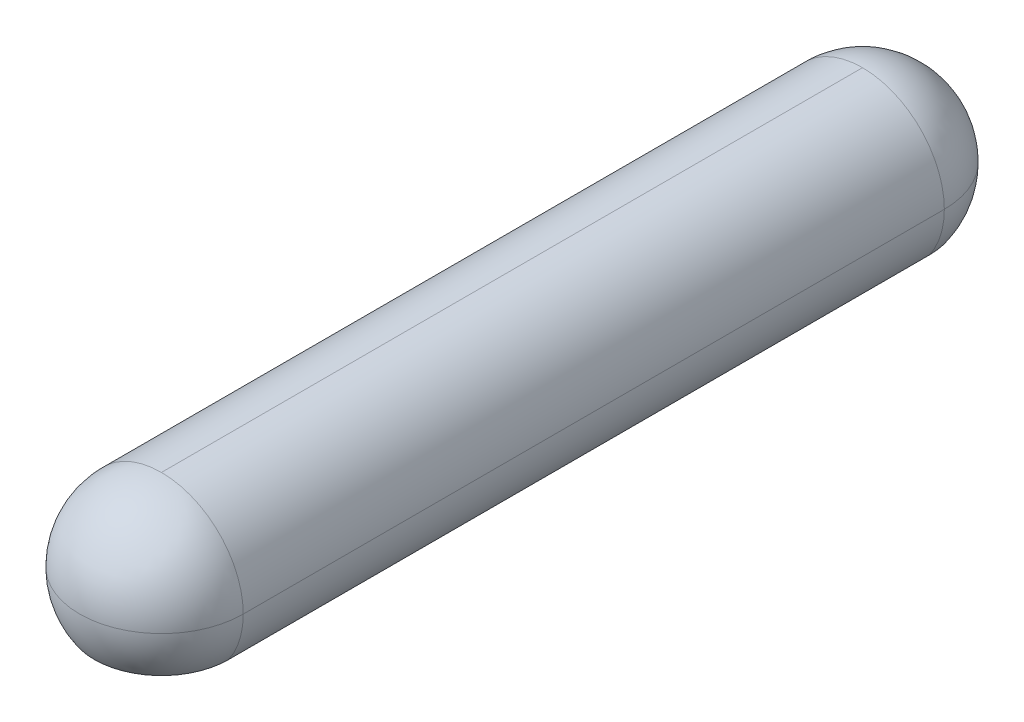
ISO-10303-21;
HEADER;
FILE_DESCRIPTION(('STEP AP214'),'2;1');
FILE_NAME('part.step','',(''),(''),'','','');
FILE_SCHEMA(('AUTOMOTIVE_DESIGN { 1 0 10303 214 1 1 1 1 }'));
ENDSEC;
DATA;
#1=APPLICATION_CONTEXT('core data for automotive mechanical design processes');
#2=APPLICATION_PROTOCOL_DEFINITION('international standard','automotive_design',2000,#1);
#3=PRODUCT_CONTEXT('',#1,'mechanical');
#4=PRODUCT('Part','Part','',(#3));
#5=PRODUCT_RELATED_PRODUCT_CATEGORY('part','',(#4));
#6=PRODUCT_DEFINITION_FORMATION('','',#4);
#7=PRODUCT_DEFINITION_CONTEXT('part definition',#1,'design');
#8=PRODUCT_DEFINITION('design','',#6,#7);
#9=PRODUCT_DEFINITION_SHAPE('','',#8);
#10=(LENGTH_UNIT() NAMED_UNIT(*) SI_UNIT(.MILLI.,.METRE.));
#11=(NAMED_UNIT(*) PLANE_ANGLE_UNIT() SI_UNIT($,.RADIAN.));
#12=(NAMED_UNIT(*) SI_UNIT($,.STERADIAN.) SOLID_ANGLE_UNIT());
#13=UNCERTAINTY_MEASURE_WITH_UNIT(LENGTH_MEASURE(1.E-05),#10,'distance_accuracy_value','');
#14=(GEOMETRIC_REPRESENTATION_CONTEXT(3) GLOBAL_UNCERTAINTY_ASSIGNED_CONTEXT((#13)) GLOBAL_UNIT_ASSIGNED_CONTEXT((#10,
#11,#12)) REPRESENTATION_CONTEXT('',''));
#15=CARTESIAN_POINT('',(0.,0.,0.));
#16=DIRECTION('',(0.,0.,1.));
#17=DIRECTION('',(1.,0.,0.));
#18=AXIS2_PLACEMENT_3D('',#15,#16,#17);
#19=CARTESIAN_POINT('',(0.,7.,-60.));
#20=DIRECTION('',(0.,1.,0.));
#21=DIRECTION('',(0.,0.,1.));
#22=AXIS2_PLACEMENT_3D('',#19,#20,#21);
#23=SPHERICAL_SURFACE('',#22,7.);
#24=CARTESIAN_POINT('',(0.,7.,-60.));
#25=DIRECTION('',(0.,0.,1.));
#26=DIRECTION('',(1.,0.,0.));
#27=AXIS2_PLACEMENT_3D('',#24,#25,#26);
#28=CIRCLE('',#27,7.);
#29=CARTESIAN_POINT('',(7.00000000000001,7.,-60.));
#30=VERTEX_POINT('',#29);
#31=CARTESIAN_POINT('',(0.,14.,-60.));
#32=VERTEX_POINT('',#31);
#33=EDGE_CURVE('E199',#30,#32,#28,.T.);
#34=ORIENTED_EDGE('',*,*,#33,.F.);
#35=CARTESIAN_POINT('',(0.,7.,-60.));
#36=DIRECTION('',(0.,-1.,0.));
#37=DIRECTION('',(0.,0.,-1.));
#38=AXIS2_PLACEMENT_3D('',#35,#36,#37);
#39=CIRCLE('',#38,7.00000000000001);
#40=CARTESIAN_POINT('',(-7.00000000000001,7.,-60.));
#41=VERTEX_POINT('',#40);
#42=EDGE_CURVE('E184',#41,#30,#39,.T.);
#43=ORIENTED_EDGE('',*,*,#42,.F.);
#44=CARTESIAN_POINT('',(0.,7.,-60.));
#45=DIRECTION('',(0.,0.,1.));
#46=DIRECTION('',(1.,0.,0.));
#47=AXIS2_PLACEMENT_3D('',#44,#45,#46);
#48=CIRCLE('',#47,7.);
#49=EDGE_CURVE('E180',#32,#41,#48,.T.);
#50=ORIENTED_EDGE('',*,*,#49,.F.);
#51=EDGE_LOOP('',(#34,#43,#50));
#52=FACE_BOUND('',#51,.T.);
#53=ADVANCED_FACE('F45',(#52),#23,.T.);
#54=CARTESIAN_POINT('',(0.,7.,0.));
#55=DIRECTION('',(0.,0.,-1.));
#56=DIRECTION('',(-1.,0.,0.));
#57=AXIS2_PLACEMENT_3D('',#54,#55,#56);
#58=CYLINDRICAL_SURFACE('',#57,7.);
#59=DIRECTION('',(0.,0.,1.));
#60=VECTOR('',#59,1.);
#61=CARTESIAN_POINT('',(0.,14.,0.));
#62=LINE('',#61,#60);
#63=CARTESIAN_POINT('',(0.,14.,0.));
#64=VERTEX_POINT('',#63);
#65=EDGE_CURVE('E203',#32,#64,#62,.T.);
#66=ORIENTED_EDGE('',*,*,#65,.F.);
#67=ORIENTED_EDGE('',*,*,#49,.T.);
#68=DIRECTION('',(0.,0.,1.));
#69=VECTOR('',#68,1.);
#70=CARTESIAN_POINT('',(-7.00000000000001,7.,-60.));
#71=LINE('',#70,#69);
#72=CARTESIAN_POINT('',(-7.,7.,0.));
#73=VERTEX_POINT('',#72);
#74=EDGE_CURVE('E179',#73,#41,#71,.F.);
#75=ORIENTED_EDGE('',*,*,#74,.F.);
#76=CARTESIAN_POINT('',(0.,7.,0.));
#77=DIRECTION('',(0.,0.,1.));
#78=DIRECTION('',(1.,0.,0.));
#79=AXIS2_PLACEMENT_3D('',#76,#77,#78);
#80=CIRCLE('',#79,7.);
#81=EDGE_CURVE('E195',#64,#73,#80,.T.);
#82=ORIENTED_EDGE('',*,*,#81,.F.);
#83=EDGE_LOOP('',(#66,#67,#75,#82));
#84=FACE_BOUND('',#83,.T.);
#85=ADVANCED_FACE('F245',(#84),#58,.T.);
#86=CARTESIAN_POINT('',(0.,7.,0.));
#87=DIRECTION('',(0.,0.,1.));
#88=DIRECTION('',(1.,0.,0.));
#89=AXIS2_PLACEMENT_3D('',#86,#87,#88);
#90=CYLINDRICAL_SURFACE('',#89,7.);
#91=ORIENTED_EDGE('',*,*,#33,.T.);
#92=ORIENTED_EDGE('',*,*,#65,.T.);
#93=CARTESIAN_POINT('',(0.,7.,0.));
#94=DIRECTION('',(0.,0.,1.));
#95=DIRECTION('',(1.,0.,0.));
#96=AXIS2_PLACEMENT_3D('',#93,#94,#95);
#97=CIRCLE('',#96,7.);
#98=CARTESIAN_POINT('',(7.,7.,0.));
#99=VERTEX_POINT('',#98);
#100=EDGE_CURVE('E191',#99,#64,#97,.T.);
#101=ORIENTED_EDGE('',*,*,#100,.F.);
#102=DIRECTION('',(0.,0.,-1.));
#103=VECTOR('',#102,1.);
#104=CARTESIAN_POINT('',(7.,7.,0.));
#105=LINE('',#104,#103);
#106=EDGE_CURVE('E54',#30,#99,#105,.F.);
#107=ORIENTED_EDGE('',*,*,#106,.F.);
#108=EDGE_LOOP('',(#91,#92,#101,#107));
#109=FACE_BOUND('',#108,.T.);
#110=ADVANCED_FACE('F242',(#109),#90,.T.);
#111=CARTESIAN_POINT('',(0.,7.,0.));
#112=DIRECTION('',(0.,1.,0.));
#113=DIRECTION('',(0.,0.,1.));
#114=AXIS2_PLACEMENT_3D('',#111,#112,#113);
#115=SPHERICAL_SURFACE('',#114,7.);
#116=ORIENTED_EDGE('',*,*,#81,.T.);
#117=CARTESIAN_POINT('',(0.,7.,0.));
#118=DIRECTION('',(0.,-1.,0.));
#119=DIRECTION('',(0.,0.,-1.));
#120=AXIS2_PLACEMENT_3D('',#117,#118,#119);
#121=CIRCLE('',#120,7.);
#122=EDGE_CURVE('E175',#99,#73,#121,.T.);
#123=ORIENTED_EDGE('',*,*,#122,.F.);
#124=ORIENTED_EDGE('',*,*,#100,.T.);
#125=EDGE_LOOP('',(#116,#123,#124));
#126=FACE_BOUND('',#125,.T.);
#127=ADVANCED_FACE('F239',(#126),#115,.T.);
#128=CARTESIAN_POINT('',(0.,7.,-60.));
#129=DIRECTION('',(0.,1.,0.));
#130=DIRECTION('',(0.,0.,1.));
#131=AXIS2_PLACEMENT_3D('',#128,#129,#130);
#132=SPHERICAL_SURFACE('',#131,7.);
#133=CARTESIAN_POINT('',(0.,3.,-60.));
#134=DIRECTION('',(0.,1.,0.));
#135=DIRECTION('',(0.,0.,1.));
#136=AXIS2_PLACEMENT_3D('',#133,#134,#135);
#137=CIRCLE('',#136,5.74456264653803);
#138=CARTESIAN_POINT('',(-5.74456264653805,3.,-60.));
#139=VERTEX_POINT('',#138);
#140=CARTESIAN_POINT('',(5.74456264653805,3.,-60.));
#141=VERTEX_POINT('',#140);
#142=EDGE_CURVE('E169',#139,#141,#137,.F.);
#143=ORIENTED_EDGE('',*,*,#142,.F.);
#144=CARTESIAN_POINT('',(0.,7.,-60.));
#145=DIRECTION('',(0.,0.,1.));
#146=DIRECTION('',(1.,0.,0.));
#147=AXIS2_PLACEMENT_3D('',#144,#145,#146);
#148=CIRCLE('',#147,7.);
#149=EDGE_CURVE('E196',#41,#139,#148,.T.);
#150=ORIENTED_EDGE('',*,*,#149,.F.);
#151=ORIENTED_EDGE('',*,*,#42,.T.);
#152=CARTESIAN_POINT('',(0.,7.,-60.));
#153=DIRECTION('',(0.,0.,1.));
#154=DIRECTION('',(1.,0.,0.));
#155=AXIS2_PLACEMENT_3D('',#152,#153,#154);
#156=CIRCLE('',#155,7.);
#157=EDGE_CURVE('E215',#141,#30,#156,.T.);
#158=ORIENTED_EDGE('',*,*,#157,.F.);
#159=EDGE_LOOP('',(#143,#150,#151,#158));
#160=FACE_BOUND('',#159,.T.);
#161=ADVANCED_FACE('F47',(#160),#132,.T.);
#162=CARTESIAN_POINT('',(0.,7.,0.));
#163=DIRECTION('',(0.,0.,1.));
#164=DIRECTION('',(1.,0.,0.));
#165=AXIS2_PLACEMENT_3D('',#162,#163,#164);
#166=CYLINDRICAL_SURFACE('',#165,7.);
#167=DIRECTION('',(0.,0.,-1.));
#168=VECTOR('',#167,1.);
#169=CARTESIAN_POINT('',(-5.74456264653805,3.,7.));
#170=LINE('',#169,#168);
#171=CARTESIAN_POINT('',(-5.74456264653805,3.,0.));
#172=VERTEX_POINT('',#171);
#173=EDGE_CURVE('E161',#172,#139,#170,.T.);
#174=ORIENTED_EDGE('',*,*,#173,.F.);
#175=CARTESIAN_POINT('',(0.,7.,0.));
#176=DIRECTION('',(0.,0.,1.));
#177=DIRECTION('',(1.,0.,0.));
#178=AXIS2_PLACEMENT_3D('',#175,#176,#177);
#179=CIRCLE('',#178,7.);
#180=EDGE_CURVE('E211',#73,#172,#179,.T.);
#181=ORIENTED_EDGE('',*,*,#180,.F.);
#182=ORIENTED_EDGE('',*,*,#74,.T.);
#183=ORIENTED_EDGE('',*,*,#149,.T.);
#184=EDGE_LOOP('',(#174,#181,#182,#183));
#185=FACE_BOUND('',#184,.T.);
#186=ADVANCED_FACE('F222',(#185),#166,.T.);
#187=CARTESIAN_POINT('',(0.,7.,-60.));
#188=DIRECTION('',(0.,0.,-1.));
#189=DIRECTION('',(-1.,0.,0.));
#190=AXIS2_PLACEMENT_3D('',#187,#188,#189);
#191=CYLINDRICAL_SURFACE('',#190,7.);
#192=DIRECTION('',(0.,0.,-1.));
#193=VECTOR('',#192,1.);
#194=CARTESIAN_POINT('',(5.74456264653805,3.,7.));
#195=LINE('',#194,#193);
#196=CARTESIAN_POINT('',(5.74456264653803,3.,0.));
#197=VERTEX_POINT('',#196);
#198=EDGE_CURVE('E68',#197,#141,#195,.T.);
#199=ORIENTED_EDGE('',*,*,#198,.T.);
#200=ORIENTED_EDGE('',*,*,#157,.T.);
#201=ORIENTED_EDGE('',*,*,#106,.T.);
#202=CARTESIAN_POINT('',(0.,7.,0.));
#203=DIRECTION('',(0.,0.,1.));
#204=DIRECTION('',(1.,0.,0.));
#205=AXIS2_PLACEMENT_3D('',#202,#203,#204);
#206=CIRCLE('',#205,7.);
#207=EDGE_CURVE('E174',#197,#99,#206,.T.);
#208=ORIENTED_EDGE('',*,*,#207,.F.);
#209=EDGE_LOOP('',(#199,#200,#201,#208));
#210=FACE_BOUND('',#209,.T.);
#211=ADVANCED_FACE('F231',(#210),#191,.T.);
#212=CARTESIAN_POINT('',(0.,7.,0.));
#213=DIRECTION('',(0.,1.,0.));
#214=DIRECTION('',(0.,0.,1.));
#215=AXIS2_PLACEMENT_3D('',#212,#213,#214);
#216=SPHERICAL_SURFACE('',#215,7.);
#217=CARTESIAN_POINT('',(0.,3.,0.));
#218=DIRECTION('',(0.,1.,0.));
#219=DIRECTION('',(0.,0.,1.));
#220=AXIS2_PLACEMENT_3D('',#217,#218,#219);
#221=CIRCLE('',#220,5.74456264653803);
#222=EDGE_CURVE('E11',#197,#172,#221,.F.);
#223=ORIENTED_EDGE('',*,*,#222,.F.);
#224=ORIENTED_EDGE('',*,*,#207,.T.);
#225=ORIENTED_EDGE('',*,*,#122,.T.);
#226=ORIENTED_EDGE('',*,*,#180,.T.);
#227=EDGE_LOOP('',(#223,#224,#225,#226));
#228=FACE_BOUND('',#227,.T.);
#229=ADVANCED_FACE('F236',(#228),#216,.T.);
#230=CARTESIAN_POINT('',(5.74456264653805,3.,7.));
#231=DIRECTION('',(0.,1.,0.));
#232=DIRECTION('',(0.,0.,1.));
#233=AXIS2_PLACEMENT_3D('',#230,#231,#232);
#234=PLANE('',#233);
#235=DIRECTION('',(0.0887576580011617,0.,-0.99605325065789));
#236=VECTOR('',#235,1.);
#237=CARTESIAN_POINT('',(-3.75,3.,0.));
#238=LINE('',#237,#236);
#239=CARTESIAN_POINT('',(-3.75,3.,0.));
#240=VERTEX_POINT('',#239);
#241=CARTESIAN_POINT('',(-2.24111981398025,3.,-16.9329052611841));
#242=VERTEX_POINT('',#241);
#243=EDGE_CURVE('E152',#240,#242,#238,.T.);
#244=ORIENTED_EDGE('',*,*,#243,.F.);
#245=CARTESIAN_POINT('',(0.,3.,0.));
#246=DIRECTION('',(0.,-1.,0.));
#247=DIRECTION('',(0.,0.,-1.));
#248=AXIS2_PLACEMENT_3D('',#245,#246,#247);
#249=CIRCLE('',#248,3.75);
#250=CARTESIAN_POINT('',(3.75,3.,0.));
#251=VERTEX_POINT('',#250);
#252=EDGE_CURVE('E61',#251,#240,#249,.T.);
#253=ORIENTED_EDGE('',*,*,#252,.F.);
#254=DIRECTION('',(0.0887576580011617,0.,0.99605325065789));
#255=VECTOR('',#254,1.);
#256=CARTESIAN_POINT('',(2.24111981398025,3.,-16.9329052611841));
#257=LINE('',#256,#255);
#258=CARTESIAN_POINT('',(2.24111981398025,3.,-16.9329052611841));
#259=VERTEX_POINT('',#258);
#260=EDGE_CURVE('E139',#259,#251,#257,.T.);
#261=ORIENTED_EDGE('',*,*,#260,.F.);
#262=CARTESIAN_POINT('',(0.,3.,-16.7332005306815));
#263=DIRECTION('',(0.,-1.,0.));
#264=DIRECTION('',(0.,0.,-1.));
#265=AXIS2_PLACEMENT_3D('',#262,#263,#264);
#266=CIRCLE('',#265,2.25);
#267=EDGE_CURVE('E143',#242,#259,#266,.T.);
#268=ORIENTED_EDGE('',*,*,#267,.F.);
#269=EDGE_LOOP('',(#244,#253,#261,#268));
#270=FACE_BOUND('',#269,.T.);
#271=ORIENTED_EDGE('',*,*,#142,.T.);
#272=ORIENTED_EDGE('',*,*,#198,.F.);
#273=ORIENTED_EDGE('',*,*,#222,.T.);
#274=ORIENTED_EDGE('',*,*,#173,.T.);
#275=EDGE_LOOP('',(#271,#272,#273,#274));
#276=FACE_BOUND('',#275,.T.);
#277=ADVANCED_FACE('F228',(#270,#276),#234,.F.);
#278=CARTESIAN_POINT('',(0.,7.,0.));
#279=DIRECTION('',(0.,-1.,0.));
#280=DIRECTION('',(0.,0.,-1.));
#281=AXIS2_PLACEMENT_3D('',#278,#279,#280);
#282=CYLINDRICAL_SURFACE('',#281,3.75);
#283=ORIENTED_EDGE('',*,*,#252,.T.);
#284=DIRECTION('',(0.,-1.,0.));
#285=VECTOR('',#284,1.);
#286=CARTESIAN_POINT('',(-3.75,7.,0.));
#287=LINE('',#286,#285);
#288=CARTESIAN_POINT('',(-3.75,7.,0.));
#289=VERTEX_POINT('',#288);
#290=EDGE_CURVE('E114',#289,#240,#287,.T.);
#291=ORIENTED_EDGE('',*,*,#290,.F.);
#292=CARTESIAN_POINT('',(0.,7.,0.));
#293=DIRECTION('',(0.,-1.,0.));
#294=DIRECTION('',(0.,0.,-1.));
#295=AXIS2_PLACEMENT_3D('',#292,#293,#294);
#296=CIRCLE('',#295,3.75);
#297=CARTESIAN_POINT('',(3.75,7.,0.));
#298=VERTEX_POINT('',#297);
#299=EDGE_CURVE('E118',#298,#289,#296,.T.);
#300=ORIENTED_EDGE('',*,*,#299,.F.);
#301=DIRECTION('',(0.,-1.,0.));
#302=VECTOR('',#301,1.);
#303=CARTESIAN_POINT('',(3.75,7.,0.));
#304=LINE('',#303,#302);
#305=EDGE_CURVE('E158',#298,#251,#304,.T.);
#306=ORIENTED_EDGE('',*,*,#305,.T.);
#307=EDGE_LOOP('',(#283,#291,#300,#306));
#308=FACE_BOUND('',#307,.T.);
#309=ADVANCED_FACE('F116',(#308),#282,.F.);
#310=CARTESIAN_POINT('',(2.24111981398025,7.,-16.9329052611841));
#311=DIRECTION('',(0.99605325065789,0.,-0.0887576580011617));
#312=DIRECTION('',(-0.0887576580011617,0.,-0.99605325065789));
#313=AXIS2_PLACEMENT_3D('',#310,#311,#312);
#314=PLANE('',#313);
#315=ORIENTED_EDGE('',*,*,#260,.T.);
#316=ORIENTED_EDGE('',*,*,#305,.F.);
#317=DIRECTION('',(0.0887576580011617,0.,0.99605325065789));
#318=VECTOR('',#317,1.);
#319=CARTESIAN_POINT('',(2.24111981398025,7.,-16.9329052611841));
#320=LINE('',#319,#318);
#321=CARTESIAN_POINT('',(2.24111981398025,7.,-16.9329052611841));
#322=VERTEX_POINT('',#321);
#323=EDGE_CURVE('E125',#322,#298,#320,.T.);
#324=ORIENTED_EDGE('',*,*,#323,.F.);
#325=DIRECTION('',(0.,-1.,0.));
#326=VECTOR('',#325,1.);
#327=CARTESIAN_POINT('',(2.24111981398025,7.,-16.9329052611841));
#328=LINE('',#327,#326);
#329=EDGE_CURVE('E162',#322,#259,#328,.T.);
#330=ORIENTED_EDGE('',*,*,#329,.T.);
#331=EDGE_LOOP('',(#315,#316,#324,#330));
#332=FACE_BOUND('',#331,.T.);
#333=ADVANCED_FACE('F275',(#332),#314,.F.);
#334=CARTESIAN_POINT('',(0.,7.,-16.7332005306815));
#335=DIRECTION('',(0.,-1.,0.));
#336=DIRECTION('',(0.,0.,-1.));
#337=AXIS2_PLACEMENT_3D('',#334,#335,#336);
#338=CYLINDRICAL_SURFACE('',#337,2.25);
#339=ORIENTED_EDGE('',*,*,#267,.T.);
#340=ORIENTED_EDGE('',*,*,#329,.F.);
#341=CARTESIAN_POINT('',(0.,7.,-16.7332005306815));
#342=DIRECTION('',(0.,-1.,0.));
#343=DIRECTION('',(0.,0.,-1.));
#344=AXIS2_PLACEMENT_3D('',#341,#342,#343);
#345=CIRCLE('',#344,2.25);
#346=CARTESIAN_POINT('',(-2.24111981398025,7.,-16.9329052611841));
#347=VERTEX_POINT('',#346);
#348=EDGE_CURVE('E134',#347,#322,#345,.T.);
#349=ORIENTED_EDGE('',*,*,#348,.F.);
#350=DIRECTION('',(0.,-1.,0.));
#351=VECTOR('',#350,1.);
#352=CARTESIAN_POINT('',(-2.24111981398025,7.,-16.9329052611841));
#353=LINE('',#352,#351);
#354=EDGE_CURVE('E124',#347,#242,#353,.T.);
#355=ORIENTED_EDGE('',*,*,#354,.T.);
#356=EDGE_LOOP('',(#339,#340,#349,#355));
#357=FACE_BOUND('',#356,.T.);
#358=ADVANCED_FACE('F278',(#357),#338,.F.);
#359=CARTESIAN_POINT('',(-3.75,7.,0.));
#360=DIRECTION('',(-0.99605325065789,0.,-0.0887576580011617));
#361=DIRECTION('',(-0.0887576580011617,0.,0.99605325065789));
#362=AXIS2_PLACEMENT_3D('',#359,#360,#361);
#363=PLANE('',#362);
#364=ORIENTED_EDGE('',*,*,#243,.T.);
#365=ORIENTED_EDGE('',*,*,#354,.F.);
#366=DIRECTION('',(0.0887576580011617,0.,-0.99605325065789));
#367=VECTOR('',#366,1.);
#368=CARTESIAN_POINT('',(-3.75,7.,0.));
#369=LINE('',#368,#367);
#370=EDGE_CURVE('E128',#289,#347,#369,.T.);
#371=ORIENTED_EDGE('',*,*,#370,.F.);
#372=ORIENTED_EDGE('',*,*,#290,.T.);
#373=EDGE_LOOP('',(#364,#365,#371,#372));
#374=FACE_BOUND('',#373,.T.);
#375=ADVANCED_FACE('F129',(#374),#363,.F.);
#376=CARTESIAN_POINT('',(0.,7.,0.));
#377=DIRECTION('',(0.,-1.,0.));
#378=DIRECTION('',(0.,0.,-1.));
#379=AXIS2_PLACEMENT_3D('',#376,#377,#378);
#380=PLANE('',#379);
#381=ORIENTED_EDGE('',*,*,#299,.T.);
#382=ORIENTED_EDGE('',*,*,#370,.T.);
#383=ORIENTED_EDGE('',*,*,#348,.T.);
#384=ORIENTED_EDGE('',*,*,#323,.T.);
#385=EDGE_LOOP('',(#381,#382,#383,#384));
#386=FACE_BOUND('',#385,.T.);
#387=ADVANCED_FACE('F136',(#386),#380,.T.);
#388=CLOSED_SHELL('',(#53,#85,#110,#127,#161,#186,#211,#229,#277,#309,#333,#358,#375,#387));
#389=MANIFOLD_SOLID_BREP('B2',#388);
#390=ADVANCED_BREP_SHAPE_REPRESENTATION('',(#18,#389),#14);
#391=SHAPE_DEFINITION_REPRESENTATION(#9,#390);
ENDSEC;
END-ISO-10303-21;
